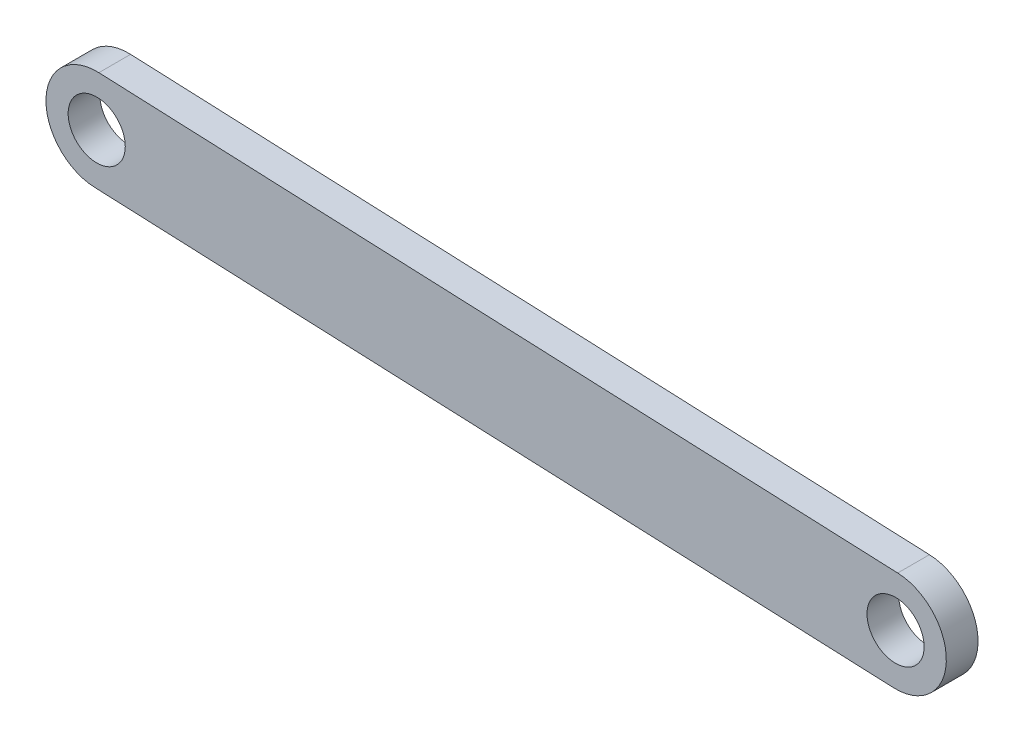
ISO-10303-21;
HEADER;
FILE_DESCRIPTION(('STEP AP214'),'2;1');
FILE_NAME('part.step','',(''),(''),'','','');
FILE_SCHEMA(('AUTOMOTIVE_DESIGN { 1 0 10303 214 1 1 1 1 }'));
ENDSEC;
DATA;
#1=APPLICATION_CONTEXT('core data for automotive mechanical design processes');
#2=APPLICATION_PROTOCOL_DEFINITION('international standard','automotive_design',2000,#1);
#3=PRODUCT_CONTEXT('',#1,'mechanical');
#4=PRODUCT('Part','Part','',(#3));
#5=PRODUCT_RELATED_PRODUCT_CATEGORY('part','',(#4));
#6=PRODUCT_DEFINITION_FORMATION('','',#4);
#7=PRODUCT_DEFINITION_CONTEXT('part definition',#1,'design');
#8=PRODUCT_DEFINITION('design','',#6,#7);
#9=PRODUCT_DEFINITION_SHAPE('','',#8);
#10=(LENGTH_UNIT() NAMED_UNIT(*) SI_UNIT(.MILLI.,.METRE.));
#11=(NAMED_UNIT(*) PLANE_ANGLE_UNIT() SI_UNIT($,.RADIAN.));
#12=(NAMED_UNIT(*) SI_UNIT($,.STERADIAN.) SOLID_ANGLE_UNIT());
#13=UNCERTAINTY_MEASURE_WITH_UNIT(LENGTH_MEASURE(1.E-05),#10,'distance_accuracy_value','');
#14=(GEOMETRIC_REPRESENTATION_CONTEXT(3) GLOBAL_UNCERTAINTY_ASSIGNED_CONTEXT((#13)) GLOBAL_UNIT_ASSIGNED_CONTEXT((#10,
#11,#12)) REPRESENTATION_CONTEXT('',''));
#15=CARTESIAN_POINT('',(0.,0.,0.));
#16=DIRECTION('',(0.,0.,1.));
#17=DIRECTION('',(1.,0.,0.));
#18=AXIS2_PLACEMENT_3D('',#15,#16,#17);
#19=CARTESIAN_POINT('',(150.977965312307,33.8432435917223,5.));
#20=DIRECTION('',(0.,0.,1.));
#21=DIRECTION('',(1.,0.,0.));
#22=AXIS2_PLACEMENT_3D('',#19,#20,#21);
#23=PLANE('',#22);
#24=CARTESIAN_POINT('',(150.977965312307,33.8432435917223,5.));
#25=DIRECTION('',(0.,0.,1.));
#26=DIRECTION('',(1.,0.,0.));
#27=AXIS2_PLACEMENT_3D('',#24,#25,#26);
#28=CIRCLE('',#27,4.49999999999999);
#29=CARTESIAN_POINT('',(155.477965312307,33.8432435917223,5.));
#30=VERTEX_POINT('',#29);
#31=EDGE_CURVE('E102',#30,#30,#28,.T.);
#32=ORIENTED_EDGE('',*,*,#31,.F.);
#33=EDGE_LOOP('',(#32));
#34=FACE_BOUND('',#33,.T.);
#35=CARTESIAN_POINT('',(150.977965312307,33.8432435917223,5.));
#36=DIRECTION('',(0.,0.,1.));
#37=DIRECTION('',(1.,0.,0.));
#38=AXIS2_PLACEMENT_3D('',#35,#36,#37);
#39=CIRCLE('',#38,8.00000000000001);
#40=CARTESIAN_POINT('',(151.31703571275,41.8360548157876,5.));
#41=VERTEX_POINT('',#40);
#42=CARTESIAN_POINT('',(150.638894911865,25.8504323676571,5.));
#43=VERTEX_POINT('',#42);
#44=EDGE_CURVE('E87',#41,#43,#39,.T.);
#45=ORIENTED_EDGE('',*,*,#44,.T.);
#46=DIRECTION('',(0.999101403008159,-0.0423838000553137,0.));
#47=VECTOR('',#46,1.);
#48=CARTESIAN_POINT('',(150.638894911865,25.8504323676571,5.));
#49=LINE('',#48,#47);
#50=CARTESIAN_POINT('',(276.525671690893,20.5100735606875,5.));
#51=VERTEX_POINT('',#50);
#52=EDGE_CURVE('E82',#43,#51,#49,.T.);
#53=ORIENTED_EDGE('',*,*,#52,.T.);
#54=CARTESIAN_POINT('',(276.864742091335,28.5028847847528,5.));
#55=DIRECTION('',(0.,0.,1.));
#56=DIRECTION('',(1.,0.,0.));
#57=AXIS2_PLACEMENT_3D('',#54,#55,#56);
#58=CIRCLE('',#57,8.00000000000001);
#59=CARTESIAN_POINT('',(277.203812491778,36.4956960088181,5.));
#60=VERTEX_POINT('',#59);
#61=EDGE_CURVE('E85',#51,#60,#58,.T.);
#62=ORIENTED_EDGE('',*,*,#61,.T.);
#63=DIRECTION('',(-0.999101403008159,0.0423838000553136,0.));
#64=VECTOR('',#63,1.);
#65=CARTESIAN_POINT('',(151.31703571275,41.8360548157876,5.));
#66=LINE('',#65,#64);
#67=EDGE_CURVE('E52',#60,#41,#66,.T.);
#68=ORIENTED_EDGE('',*,*,#67,.T.);
#69=EDGE_LOOP('',(#45,#53,#62,#68));
#70=FACE_BOUND('',#69,.T.);
#71=CARTESIAN_POINT('',(276.864742091335,28.5028847847528,5.));
#72=DIRECTION('',(0.,0.,1.));
#73=DIRECTION('',(1.,0.,0.));
#74=AXIS2_PLACEMENT_3D('',#71,#72,#73);
#75=CIRCLE('',#74,4.50000000000002);
#76=CARTESIAN_POINT('',(281.364742091335,28.5028847847528,5.));
#77=VERTEX_POINT('',#76);
#78=EDGE_CURVE('E117',#77,#77,#75,.T.);
#79=ORIENTED_EDGE('',*,*,#78,.F.);
#80=EDGE_LOOP('',(#79));
#81=FACE_BOUND('',#80,.T.);
#82=ADVANCED_FACE('F35',(#34,#70,#81),#23,.T.);
#83=CARTESIAN_POINT('',(150.977965312307,33.8432435917223,0.));
#84=DIRECTION('',(0.,0.,1.));
#85=DIRECTION('',(1.,0.,0.));
#86=AXIS2_PLACEMENT_3D('',#83,#84,#85);
#87=PLANE('',#86);
#88=CARTESIAN_POINT('',(150.977965312307,33.8432435917223,0.));
#89=DIRECTION('',(0.,0.,1.));
#90=DIRECTION('',(1.,0.,0.));
#91=AXIS2_PLACEMENT_3D('',#88,#89,#90);
#92=CIRCLE('',#91,8.00000000000001);
#93=CARTESIAN_POINT('',(151.31703571275,41.8360548157876,0.));
#94=VERTEX_POINT('',#93);
#95=CARTESIAN_POINT('',(150.638894911865,25.8504323676571,0.));
#96=VERTEX_POINT('',#95);
#97=EDGE_CURVE('E99',#94,#96,#92,.T.);
#98=ORIENTED_EDGE('',*,*,#97,.F.);
#99=DIRECTION('',(-0.999101403008159,0.0423838000553136,0.));
#100=VECTOR('',#99,1.);
#101=CARTESIAN_POINT('',(151.31703571275,41.8360548157876,0.));
#102=LINE('',#101,#100);
#103=CARTESIAN_POINT('',(277.203812491778,36.4956960088181,0.));
#104=VERTEX_POINT('',#103);
#105=EDGE_CURVE('E75',#104,#94,#102,.T.);
#106=ORIENTED_EDGE('',*,*,#105,.F.);
#107=CARTESIAN_POINT('',(276.864742091335,28.5028847847528,0.));
#108=DIRECTION('',(0.,0.,1.));
#109=DIRECTION('',(1.,0.,0.));
#110=AXIS2_PLACEMENT_3D('',#107,#108,#109);
#111=CIRCLE('',#110,8.00000000000001);
#112=CARTESIAN_POINT('',(276.525671690893,20.5100735606875,0.));
#113=VERTEX_POINT('',#112);
#114=EDGE_CURVE('E69',#113,#104,#111,.T.);
#115=ORIENTED_EDGE('',*,*,#114,.F.);
#116=DIRECTION('',(0.999101403008159,-0.0423838000553137,0.));
#117=VECTOR('',#116,1.);
#118=CARTESIAN_POINT('',(150.638894911865,25.8504323676571,0.));
#119=LINE('',#118,#117);
#120=EDGE_CURVE('E91',#96,#113,#119,.T.);
#121=ORIENTED_EDGE('',*,*,#120,.F.);
#122=EDGE_LOOP('',(#98,#106,#115,#121));
#123=FACE_BOUND('',#122,.T.);
#124=CARTESIAN_POINT('',(150.977965312307,33.8432435917223,0.));
#125=DIRECTION('',(0.,0.,1.));
#126=DIRECTION('',(1.,0.,0.));
#127=AXIS2_PLACEMENT_3D('',#124,#125,#126);
#128=CIRCLE('',#127,4.49999999999999);
#129=CARTESIAN_POINT('',(155.477965312307,33.8432435917223,0.));
#130=VERTEX_POINT('',#129);
#131=EDGE_CURVE('E114',#130,#130,#128,.T.);
#132=ORIENTED_EDGE('',*,*,#131,.T.);
#133=EDGE_LOOP('',(#132));
#134=FACE_BOUND('',#133,.T.);
#135=CARTESIAN_POINT('',(276.864742091335,28.5028847847528,0.));
#136=DIRECTION('',(0.,0.,1.));
#137=DIRECTION('',(1.,0.,0.));
#138=AXIS2_PLACEMENT_3D('',#135,#136,#137);
#139=CIRCLE('',#138,4.50000000000002);
#140=CARTESIAN_POINT('',(281.364742091335,28.5028847847528,0.));
#141=VERTEX_POINT('',#140);
#142=EDGE_CURVE('E120',#141,#141,#139,.T.);
#143=ORIENTED_EDGE('',*,*,#142,.T.);
#144=EDGE_LOOP('',(#143));
#145=FACE_BOUND('',#144,.T.);
#146=ADVANCED_FACE('F110',(#123,#134,#145),#87,.F.);
#147=CARTESIAN_POINT('',(150.977965312307,33.8432435917223,5.));
#148=DIRECTION('',(0.,0.,-1.));
#149=DIRECTION('',(-1.,0.,0.));
#150=AXIS2_PLACEMENT_3D('',#147,#148,#149);
#151=CYLINDRICAL_SURFACE('',#150,8.00000000000001);
#152=ORIENTED_EDGE('',*,*,#97,.T.);
#153=DIRECTION('',(0.,0.,-1.));
#154=VECTOR('',#153,1.);
#155=CARTESIAN_POINT('',(150.638894911865,25.8504323676571,5.));
#156=LINE('',#155,#154);
#157=EDGE_CURVE('E11',#43,#96,#156,.T.);
#158=ORIENTED_EDGE('',*,*,#157,.F.);
#159=ORIENTED_EDGE('',*,*,#44,.F.);
#160=DIRECTION('',(0.,0.,-1.));
#161=VECTOR('',#160,1.);
#162=CARTESIAN_POINT('',(151.31703571275,41.8360548157876,5.));
#163=LINE('',#162,#161);
#164=EDGE_CURVE('E95',#41,#94,#163,.T.);
#165=ORIENTED_EDGE('',*,*,#164,.T.);
#166=EDGE_LOOP('',(#152,#158,#159,#165));
#167=FACE_BOUND('',#166,.T.);
#168=ADVANCED_FACE('F37',(#167),#151,.T.);
#169=CARTESIAN_POINT('',(150.638894911865,25.8504323676571,5.));
#170=DIRECTION('',(0.0423838000553137,0.999101403008159,0.));
#171=DIRECTION('',(-0.999101403008159,0.0423838000553137,0.));
#172=AXIS2_PLACEMENT_3D('',#169,#170,#171);
#173=PLANE('',#172);
#174=ORIENTED_EDGE('',*,*,#120,.T.);
#175=DIRECTION('',(0.,0.,-1.));
#176=VECTOR('',#175,1.);
#177=CARTESIAN_POINT('',(276.525671690893,20.5100735606875,5.));
#178=LINE('',#177,#176);
#179=EDGE_CURVE('E44',#51,#113,#178,.T.);
#180=ORIENTED_EDGE('',*,*,#179,.F.);
#181=ORIENTED_EDGE('',*,*,#52,.F.);
#182=ORIENTED_EDGE('',*,*,#157,.T.);
#183=EDGE_LOOP('',(#174,#180,#181,#182));
#184=FACE_BOUND('',#183,.T.);
#185=ADVANCED_FACE('F90',(#184),#173,.F.);
#186=CARTESIAN_POINT('',(276.864742091335,28.5028847847528,5.));
#187=DIRECTION('',(0.,0.,-1.));
#188=DIRECTION('',(-1.,0.,0.));
#189=AXIS2_PLACEMENT_3D('',#186,#187,#188);
#190=CYLINDRICAL_SURFACE('',#189,8.00000000000001);
#191=ORIENTED_EDGE('',*,*,#114,.T.);
#192=DIRECTION('',(0.,0.,-1.));
#193=VECTOR('',#192,1.);
#194=CARTESIAN_POINT('',(277.203812491778,36.4956960088181,5.));
#195=LINE('',#194,#193);
#196=EDGE_CURVE('E92',#60,#104,#195,.T.);
#197=ORIENTED_EDGE('',*,*,#196,.F.);
#198=ORIENTED_EDGE('',*,*,#61,.F.);
#199=ORIENTED_EDGE('',*,*,#179,.T.);
#200=EDGE_LOOP('',(#191,#197,#198,#199));
#201=FACE_BOUND('',#200,.T.);
#202=ADVANCED_FACE('F93',(#201),#190,.T.);
#203=CARTESIAN_POINT('',(151.31703571275,41.8360548157876,5.));
#204=DIRECTION('',(-0.0423838000553136,-0.999101403008159,0.));
#205=DIRECTION('',(0.999101403008159,-0.0423838000553136,0.));
#206=AXIS2_PLACEMENT_3D('',#203,#204,#205);
#207=PLANE('',#206);
#208=ORIENTED_EDGE('',*,*,#105,.T.);
#209=ORIENTED_EDGE('',*,*,#164,.F.);
#210=ORIENTED_EDGE('',*,*,#67,.F.);
#211=ORIENTED_EDGE('',*,*,#196,.T.);
#212=EDGE_LOOP('',(#208,#209,#210,#211));
#213=FACE_BOUND('',#212,.T.);
#214=ADVANCED_FACE('F107',(#213),#207,.F.);
#215=CARTESIAN_POINT('',(150.977965312307,33.8432435917223,5.));
#216=DIRECTION('',(0.,0.,-1.));
#217=DIRECTION('',(-1.,0.,0.));
#218=AXIS2_PLACEMENT_3D('',#215,#216,#217);
#219=CYLINDRICAL_SURFACE('',#218,4.49999999999999);
#220=ORIENTED_EDGE('',*,*,#31,.T.);
#221=EDGE_LOOP('',(#220));
#222=FACE_BOUND('',#221,.T.);
#223=ORIENTED_EDGE('',*,*,#131,.F.);
#224=EDGE_LOOP('',(#223));
#225=FACE_BOUND('',#224,.T.);
#226=ADVANCED_FACE('F137',(#222,#225),#219,.F.);
#227=CARTESIAN_POINT('',(276.864742091335,28.5028847847528,5.));
#228=DIRECTION('',(0.,0.,-1.));
#229=DIRECTION('',(-1.,0.,0.));
#230=AXIS2_PLACEMENT_3D('',#227,#228,#229);
#231=CYLINDRICAL_SURFACE('',#230,4.50000000000002);
#232=ORIENTED_EDGE('',*,*,#78,.T.);
#233=EDGE_LOOP('',(#232));
#234=FACE_BOUND('',#233,.T.);
#235=ORIENTED_EDGE('',*,*,#142,.F.);
#236=EDGE_LOOP('',(#235));
#237=FACE_BOUND('',#236,.T.);
#238=ADVANCED_FACE('F126',(#234,#237),#231,.F.);
#239=CLOSED_SHELL('',(#82,#146,#168,#185,#202,#214,#226,#238));
#240=MANIFOLD_SOLID_BREP('B2',#239);
#241=ADVANCED_BREP_SHAPE_REPRESENTATION('',(#18,#240),#14);
#242=SHAPE_DEFINITION_REPRESENTATION(#9,#241);
ENDSEC;
END-ISO-10303-21;
